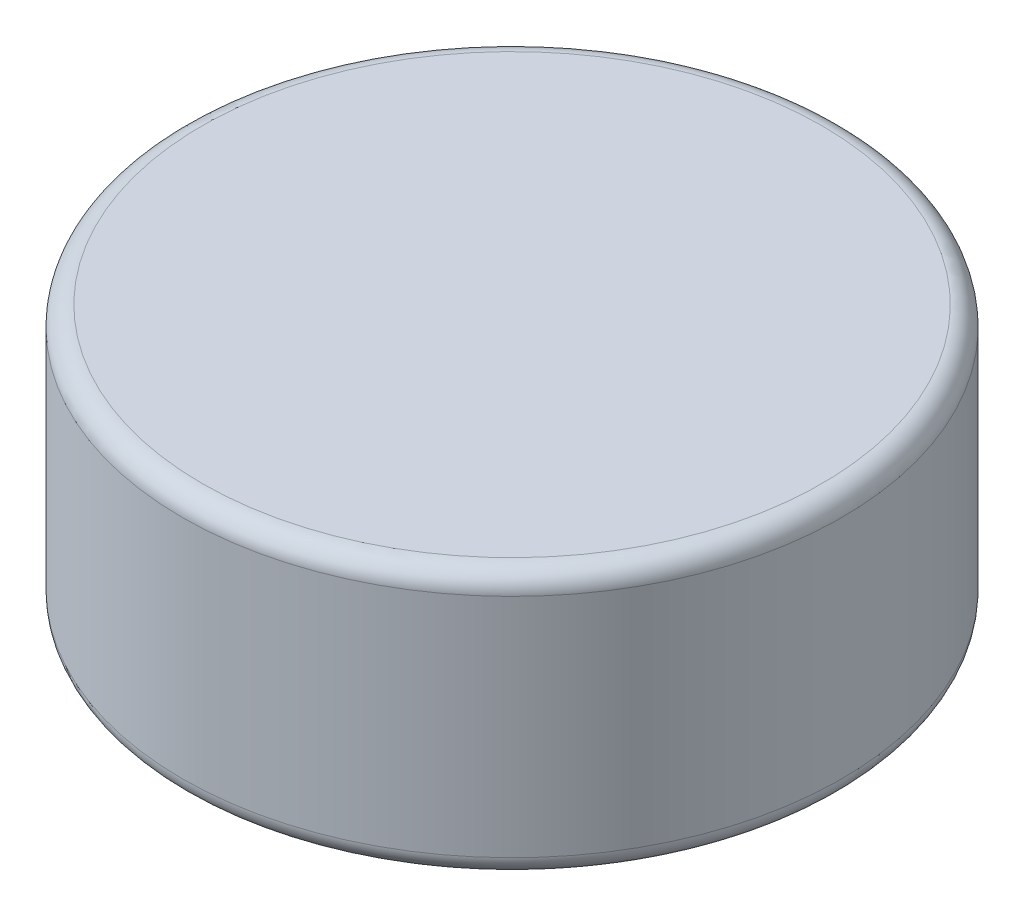
ISO-10303-21;
HEADER;
FILE_DESCRIPTION(('STEP AP214'),'2;1');
FILE_NAME('part.step','',(''),(''),'','','');
FILE_SCHEMA(('AUTOMOTIVE_DESIGN { 1 0 10303 214 1 1 1 1 }'));
ENDSEC;
DATA;
#1=APPLICATION_CONTEXT('core data for automotive mechanical design processes');
#2=APPLICATION_PROTOCOL_DEFINITION('international standard','automotive_design',2000,#1);
#3=PRODUCT_CONTEXT('',#1,'mechanical');
#4=PRODUCT('Part','Part','',(#3));
#5=PRODUCT_RELATED_PRODUCT_CATEGORY('part','',(#4));
#6=PRODUCT_DEFINITION_FORMATION('','',#4);
#7=PRODUCT_DEFINITION_CONTEXT('part definition',#1,'design');
#8=PRODUCT_DEFINITION('design','',#6,#7);
#9=PRODUCT_DEFINITION_SHAPE('','',#8);
#10=(LENGTH_UNIT() NAMED_UNIT(*) SI_UNIT(.MILLI.,.METRE.));
#11=(NAMED_UNIT(*) PLANE_ANGLE_UNIT() SI_UNIT($,.RADIAN.));
#12=(NAMED_UNIT(*) SI_UNIT($,.STERADIAN.) SOLID_ANGLE_UNIT());
#13=UNCERTAINTY_MEASURE_WITH_UNIT(LENGTH_MEASURE(1.E-05),#10,'distance_accuracy_value','');
#14=(GEOMETRIC_REPRESENTATION_CONTEXT(3) GLOBAL_UNCERTAINTY_ASSIGNED_CONTEXT((#13)) GLOBAL_UNIT_ASSIGNED_CONTEXT((#10,
#11,#12)) REPRESENTATION_CONTEXT('',''));
#15=CARTESIAN_POINT('',(0.,0.,0.));
#16=DIRECTION('',(0.,0.,1.));
#17=DIRECTION('',(1.,0.,0.));
#18=AXIS2_PLACEMENT_3D('',#15,#16,#17);
#19=CARTESIAN_POINT('',(0.,27.,0.));
#20=DIRECTION('',(0.,-1.,0.));
#21=DIRECTION('',(0.,0.,-1.));
#22=AXIS2_PLACEMENT_3D('',#19,#20,#21);
#23=CYLINDRICAL_SURFACE('',#22,33.5);
#24=CARTESIAN_POINT('',(0.,2.,0.));
#25=DIRECTION('',(0.,1.,0.));
#26=DIRECTION('',(0.,0.,1.));
#27=AXIS2_PLACEMENT_3D('',#24,#25,#26);
#28=CIRCLE('',#27,33.5);
#29=CARTESIAN_POINT('',(0.,2.,33.5));
#30=VERTEX_POINT('',#29);
#31=EDGE_CURVE('E59',#30,#30,#28,.T.);
#32=ORIENTED_EDGE('',*,*,#31,.T.);
#33=EDGE_LOOP('',(#32));
#34=FACE_BOUND('',#33,.T.);
#35=CARTESIAN_POINT('',(0.,25.,0.));
#36=DIRECTION('',(0.,1.,0.));
#37=DIRECTION('',(0.,0.,1.));
#38=AXIS2_PLACEMENT_3D('',#35,#36,#37);
#39=CIRCLE('',#38,33.5);
#40=CARTESIAN_POINT('',(0.,25.,33.5));
#41=VERTEX_POINT('',#40);
#42=EDGE_CURVE('E64',#41,#41,#39,.F.);
#43=ORIENTED_EDGE('',*,*,#42,.T.);
#44=EDGE_LOOP('',(#43));
#45=FACE_BOUND('',#44,.T.);
#46=ADVANCED_FACE('F44',(#34,#45),#23,.T.);
#47=CARTESIAN_POINT('',(0.,27.,0.));
#48=DIRECTION('',(0.,1.,0.));
#49=DIRECTION('',(0.,0.,1.));
#50=AXIS2_PLACEMENT_3D('',#47,#48,#49);
#51=PLANE('',#50);
#52=CARTESIAN_POINT('',(0.,27.,0.));
#53=DIRECTION('',(0.,1.,0.));
#54=DIRECTION('',(0.,0.,1.));
#55=AXIS2_PLACEMENT_3D('',#52,#53,#54);
#56=CIRCLE('',#55,31.5);
#57=CARTESIAN_POINT('',(0.,27.,31.5));
#58=VERTEX_POINT('',#57);
#59=EDGE_CURVE('E51',#58,#58,#56,.T.);
#60=ORIENTED_EDGE('',*,*,#59,.T.);
#61=EDGE_LOOP('',(#60));
#62=FACE_BOUND('',#61,.T.);
#63=ADVANCED_FACE('F101',(#62),#51,.T.);
#64=CARTESIAN_POINT('',(0.,0.,0.));
#65=DIRECTION('',(0.,1.,0.));
#66=DIRECTION('',(0.,0.,1.));
#67=AXIS2_PLACEMENT_3D('',#64,#65,#66);
#68=PLANE('',#67);
#69=CARTESIAN_POINT('',(0.,0.,0.));
#70=DIRECTION('',(0.,1.,0.));
#71=DIRECTION('',(0.,0.,1.));
#72=AXIS2_PLACEMENT_3D('',#69,#70,#71);
#73=CIRCLE('',#72,5.75);
#74=CARTESIAN_POINT('',(0.,0.,5.75));
#75=VERTEX_POINT('',#74);
#76=EDGE_CURVE('E12',#75,#75,#73,.F.);
#77=ORIENTED_EDGE('',*,*,#76,.F.);
#78=EDGE_LOOP('',(#77));
#79=FACE_BOUND('',#78,.T.);
#80=CARTESIAN_POINT('',(0.,0.,0.));
#81=DIRECTION('',(0.,1.,0.));
#82=DIRECTION('',(0.,0.,1.));
#83=AXIS2_PLACEMENT_3D('',#80,#81,#82);
#84=CIRCLE('',#83,31.5);
#85=CARTESIAN_POINT('',(0.,0.,31.5));
#86=VERTEX_POINT('',#85);
#87=EDGE_CURVE('E55',#86,#86,#84,.F.);
#88=ORIENTED_EDGE('',*,*,#87,.T.);
#89=EDGE_LOOP('',(#88));
#90=FACE_BOUND('',#89,.T.);
#91=ADVANCED_FACE('F107',(#79,#90),#68,.F.);
#92=CARTESIAN_POINT('',(0.,2.,0.));
#93=DIRECTION('',(0.,1.,0.));
#94=DIRECTION('',(0.,0.,1.));
#95=AXIS2_PLACEMENT_3D('',#92,#93,#94);
#96=TOROIDAL_SURFACE('',#95,31.5,2.);
#97=ORIENTED_EDGE('',*,*,#87,.F.);
#98=EDGE_LOOP('',(#97));
#99=FACE_BOUND('',#98,.T.);
#100=ORIENTED_EDGE('',*,*,#31,.F.);
#101=EDGE_LOOP('',(#100));
#102=FACE_BOUND('',#101,.T.);
#103=ADVANCED_FACE('F97',(#99,#102),#96,.T.);
#104=CARTESIAN_POINT('',(0.,25.,0.));
#105=DIRECTION('',(0.,1.,0.));
#106=DIRECTION('',(0.,0.,1.));
#107=AXIS2_PLACEMENT_3D('',#104,#105,#106);
#108=TOROIDAL_SURFACE('',#107,31.5,2.);
#109=ORIENTED_EDGE('',*,*,#42,.F.);
#110=EDGE_LOOP('',(#109));
#111=FACE_BOUND('',#110,.T.);
#112=ORIENTED_EDGE('',*,*,#59,.F.);
#113=EDGE_LOOP('',(#112));
#114=FACE_BOUND('',#113,.T.);
#115=ADVANCED_FACE('F46',(#111,#114),#108,.T.);
#116=CARTESIAN_POINT('',(0.,-2.,0.));
#117=DIRECTION('',(0.,1.,0.));
#118=DIRECTION('',(0.,0.,1.));
#119=AXIS2_PLACEMENT_3D('',#116,#117,#118);
#120=CYLINDRICAL_SURFACE('',#119,5.75);
#121=CARTESIAN_POINT('',(0.,-2.,0.));
#122=DIRECTION('',(0.,-1.,0.));
#123=DIRECTION('',(0.,0.,-1.));
#124=AXIS2_PLACEMENT_3D('',#121,#122,#123);
#125=CIRCLE('',#124,5.75);
#126=CARTESIAN_POINT('',(0.,-2.,-5.75));
#127=VERTEX_POINT('',#126);
#128=EDGE_CURVE('E67',#127,#127,#125,.T.);
#129=ORIENTED_EDGE('',*,*,#128,.F.);
#130=EDGE_LOOP('',(#129));
#131=FACE_BOUND('',#130,.T.);
#132=ORIENTED_EDGE('',*,*,#76,.T.);
#133=EDGE_LOOP('',(#132));
#134=FACE_BOUND('',#133,.T.);
#135=ADVANCED_FACE('F88',(#131,#134),#120,.T.);
#136=CARTESIAN_POINT('',(0.,-2.,0.));
#137=DIRECTION('',(0.,-1.,0.));
#138=DIRECTION('',(0.,0.,-1.));
#139=AXIS2_PLACEMENT_3D('',#136,#137,#138);
#140=PLANE('',#139);
#141=CARTESIAN_POINT('',(0.,-2.,0.));
#142=DIRECTION('',(0.,-1.,0.));
#143=DIRECTION('',(0.,0.,-1.));
#144=AXIS2_PLACEMENT_3D('',#141,#142,#143);
#145=CIRCLE('',#144,3.);
#146=CARTESIAN_POINT('',(0.,-2.,-3.));
#147=VERTEX_POINT('',#146);
#148=EDGE_CURVE('E71',#147,#147,#145,.T.);
#149=ORIENTED_EDGE('',*,*,#148,.F.);
#150=EDGE_LOOP('',(#149));
#151=FACE_BOUND('',#150,.T.);
#152=ORIENTED_EDGE('',*,*,#128,.T.);
#153=EDGE_LOOP('',(#152));
#154=FACE_BOUND('',#153,.T.);
#155=ADVANCED_FACE('F82',(#151,#154),#140,.T.);
#156=CARTESIAN_POINT('',(0.,3.,0.));
#157=DIRECTION('',(0.,-1.,0.));
#158=DIRECTION('',(0.,0.,-1.));
#159=AXIS2_PLACEMENT_3D('',#156,#157,#158);
#160=CYLINDRICAL_SURFACE('',#159,3.);
#161=CARTESIAN_POINT('',(0.,3.,0.));
#162=DIRECTION('',(0.,-1.,0.));
#163=DIRECTION('',(0.,0.,-1.));
#164=AXIS2_PLACEMENT_3D('',#161,#162,#163);
#165=CIRCLE('',#164,3.);
#166=CARTESIAN_POINT('',(0.,3.,-3.));
#167=VERTEX_POINT('',#166);
#168=EDGE_CURVE('E70',#167,#167,#165,.T.);
#169=ORIENTED_EDGE('',*,*,#168,.F.);
#170=EDGE_LOOP('',(#169));
#171=FACE_BOUND('',#170,.T.);
#172=ORIENTED_EDGE('',*,*,#148,.T.);
#173=EDGE_LOOP('',(#172));
#174=FACE_BOUND('',#173,.T.);
#175=ADVANCED_FACE('F79',(#171,#174),#160,.F.);
#176=CARTESIAN_POINT('',(0.,3.,0.));
#177=DIRECTION('',(0.,-1.,0.));
#178=DIRECTION('',(0.,0.,-1.));
#179=AXIS2_PLACEMENT_3D('',#176,#177,#178);
#180=PLANE('',#179);
#181=ORIENTED_EDGE('',*,*,#168,.T.);
#182=EDGE_LOOP('',(#181));
#183=FACE_BOUND('',#182,.T.);
#184=ADVANCED_FACE('F77',(#183),#180,.T.);
#185=CLOSED_SHELL('',(#46,#63,#91,#103,#115,#135,#155,#175,#184));
#186=MANIFOLD_SOLID_BREP('B2',#185);
#187=ADVANCED_BREP_SHAPE_REPRESENTATION('',(#18,#186),#14);
#188=SHAPE_DEFINITION_REPRESENTATION(#9,#187);
ENDSEC;
END-ISO-10303-21;
